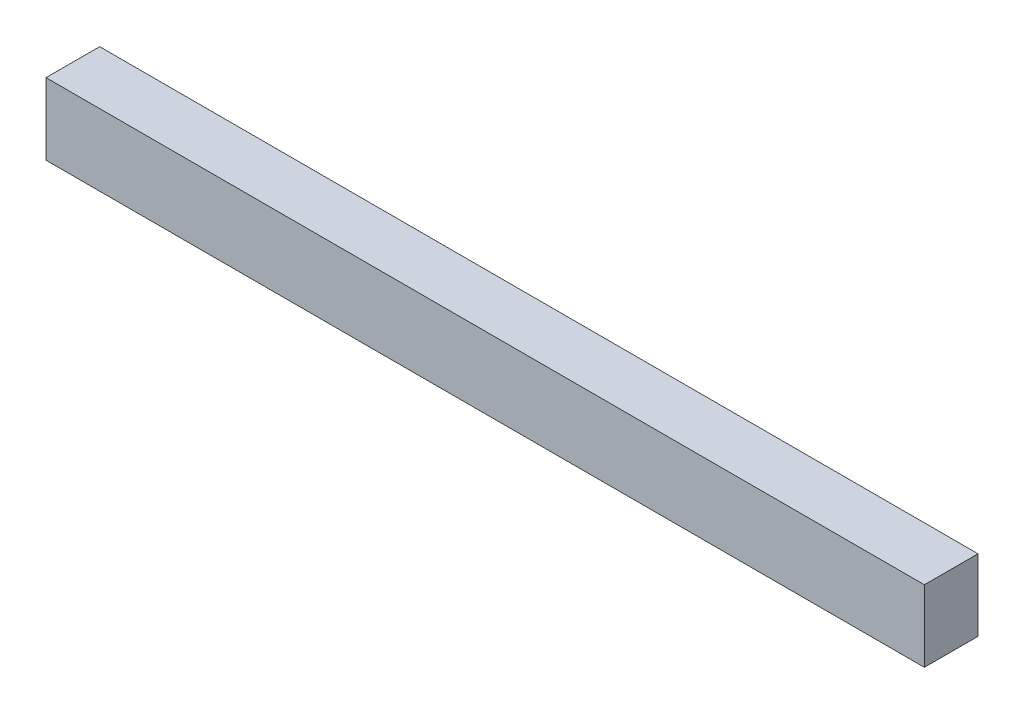
ISO-10303-21;
HEADER;
FILE_DESCRIPTION(('STEP AP214'),'2;1');
FILE_NAME('part.step','',(''),(''),'','','');
FILE_SCHEMA(('AUTOMOTIVE_DESIGN { 1 0 10303 214 1 1 1 1 }'));
ENDSEC;
DATA;
#1=APPLICATION_CONTEXT('core data for automotive mechanical design processes');
#2=APPLICATION_PROTOCOL_DEFINITION('international standard','automotive_design',2000,#1);
#3=PRODUCT_CONTEXT('',#1,'mechanical');
#4=PRODUCT('Part','Part','',(#3));
#5=PRODUCT_RELATED_PRODUCT_CATEGORY('part','',(#4));
#6=PRODUCT_DEFINITION_FORMATION('','',#4);
#7=PRODUCT_DEFINITION_CONTEXT('part definition',#1,'design');
#8=PRODUCT_DEFINITION('design','',#6,#7);
#9=PRODUCT_DEFINITION_SHAPE('','',#8);
#10=(LENGTH_UNIT() NAMED_UNIT(*) SI_UNIT(.MILLI.,.METRE.));
#11=(NAMED_UNIT(*) PLANE_ANGLE_UNIT() SI_UNIT($,.RADIAN.));
#12=(NAMED_UNIT(*) SI_UNIT($,.STERADIAN.) SOLID_ANGLE_UNIT());
#13=UNCERTAINTY_MEASURE_WITH_UNIT(LENGTH_MEASURE(1.E-05),#10,'distance_accuracy_value','');
#14=(GEOMETRIC_REPRESENTATION_CONTEXT(3) GLOBAL_UNCERTAINTY_ASSIGNED_CONTEXT((#13)) GLOBAL_UNIT_ASSIGNED_CONTEXT((#10,
#11,#12)) REPRESENTATION_CONTEXT('',''));
#15=CARTESIAN_POINT('',(0.,0.,0.));
#16=DIRECTION('',(0.,0.,1.));
#17=DIRECTION('',(1.,0.,0.));
#18=AXIS2_PLACEMENT_3D('',#15,#16,#17);
#19=CARTESIAN_POINT('',(-77.978,6.34999999999999,4.7625));
#20=DIRECTION('',(1.,0.,0.));
#21=DIRECTION('',(0.,0.,-1.));
#22=AXIS2_PLACEMENT_3D('',#19,#20,#21);
#23=PLANE('',#22);
#24=DIRECTION('',(0.,-1.,0.));
#25=VECTOR('',#24,1.);
#26=CARTESIAN_POINT('',(-77.978,6.34999999999999,-4.7625));
#27=LINE('',#26,#25);
#28=CARTESIAN_POINT('',(-77.978,6.34999999999999,-4.7625));
#29=VERTEX_POINT('',#28);
#30=CARTESIAN_POINT('',(-77.978,-6.35,-4.7625));
#31=VERTEX_POINT('',#30);
#32=EDGE_CURVE('E416',#29,#31,#27,.T.);
#33=ORIENTED_EDGE('',*,*,#32,.T.);
#34=DIRECTION('',(0.,0.,-1.));
#35=VECTOR('',#34,1.);
#36=CARTESIAN_POINT('',(-77.978,-6.35,4.7625));
#37=LINE('',#36,#35);
#38=CARTESIAN_POINT('',(-77.978,-6.35,4.7625));
#39=VERTEX_POINT('',#38);
#40=EDGE_CURVE('E11',#39,#31,#37,.T.);
#41=ORIENTED_EDGE('',*,*,#40,.F.);
#42=DIRECTION('',(0.,-1.,0.));
#43=VECTOR('',#42,1.);
#44=CARTESIAN_POINT('',(-77.978,6.34999999999999,4.7625));
#45=LINE('',#44,#43);
#46=CARTESIAN_POINT('',(-77.978,6.34999999999999,4.7625));
#47=VERTEX_POINT('',#46);
#48=EDGE_CURVE('E434',#47,#39,#45,.T.);
#49=ORIENTED_EDGE('',*,*,#48,.F.);
#50=DIRECTION('',(0.,0.,-1.));
#51=VECTOR('',#50,1.);
#52=CARTESIAN_POINT('',(-77.978,6.34999999999999,4.7625));
#53=LINE('',#52,#51);
#54=EDGE_CURVE('E428',#47,#29,#53,.T.);
#55=ORIENTED_EDGE('',*,*,#54,.T.);
#56=EDGE_LOOP('',(#33,#41,#49,#55));
#57=FACE_BOUND('',#56,.T.);
#58=ADVANCED_FACE('F372',(#57),#23,.F.);
#59=CARTESIAN_POINT('',(-77.978,-6.35,4.7625));
#60=DIRECTION('',(0.,1.,0.));
#61=DIRECTION('',(0.,0.,1.));
#62=AXIS2_PLACEMENT_3D('',#59,#60,#61);
#63=PLANE('',#62);
#64=DIRECTION('',(1.,0.,0.));
#65=VECTOR('',#64,1.);
#66=CARTESIAN_POINT('',(-77.978,-6.35,-4.7625));
#67=LINE('',#66,#65);
#68=CARTESIAN_POINT('',(77.978,-6.35,-4.7625));
#69=VERTEX_POINT('',#68);
#70=EDGE_CURVE('E412',#31,#69,#67,.T.);
#71=ORIENTED_EDGE('',*,*,#70,.T.);
#72=DIRECTION('',(0.,0.,-1.));
#73=VECTOR('',#72,1.);
#74=CARTESIAN_POINT('',(77.978,-6.35,4.7625));
#75=LINE('',#74,#73);
#76=CARTESIAN_POINT('',(77.978,-6.35,4.7625));
#77=VERTEX_POINT('',#76);
#78=EDGE_CURVE('E379',#77,#69,#75,.T.);
#79=ORIENTED_EDGE('',*,*,#78,.F.);
#80=DIRECTION('',(1.,0.,0.));
#81=VECTOR('',#80,1.);
#82=CARTESIAN_POINT('',(-77.978,-6.35,4.7625));
#83=LINE('',#82,#81);
#84=EDGE_CURVE('E424',#39,#77,#83,.T.);
#85=ORIENTED_EDGE('',*,*,#84,.F.);
#86=ORIENTED_EDGE('',*,*,#40,.T.);
#87=EDGE_LOOP('',(#71,#79,#85,#86));
#88=FACE_BOUND('',#87,.T.);
#89=ADVANCED_FACE('F423',(#88),#63,.F.);
#90=CARTESIAN_POINT('',(77.978,6.34999999999999,4.7625));
#91=DIRECTION('',(-1.,0.,0.));
#92=DIRECTION('',(0.,0.,1.));
#93=AXIS2_PLACEMENT_3D('',#90,#91,#92);
#94=PLANE('',#93);
#95=DIRECTION('',(0.,1.,0.));
#96=VECTOR('',#95,1.);
#97=CARTESIAN_POINT('',(77.978,6.34999999999999,-4.7625));
#98=LINE('',#97,#96);
#99=CARTESIAN_POINT('',(77.978,6.34999999999999,-4.7625));
#100=VERTEX_POINT('',#99);
#101=EDGE_CURVE('E417',#69,#100,#98,.T.);
#102=ORIENTED_EDGE('',*,*,#101,.T.);
#103=DIRECTION('',(0.,0.,-1.));
#104=VECTOR('',#103,1.);
#105=CARTESIAN_POINT('',(77.978,6.34999999999999,4.7625));
#106=LINE('',#105,#104);
#107=CARTESIAN_POINT('',(77.978,6.34999999999999,4.7625));
#108=VERTEX_POINT('',#107);
#109=EDGE_CURVE('E440',#108,#100,#106,.T.);
#110=ORIENTED_EDGE('',*,*,#109,.F.);
#111=DIRECTION('',(0.,1.,0.));
#112=VECTOR('',#111,1.);
#113=CARTESIAN_POINT('',(77.978,6.34999999999999,4.7625));
#114=LINE('',#113,#112);
#115=EDGE_CURVE('E391',#77,#108,#114,.T.);
#116=ORIENTED_EDGE('',*,*,#115,.F.);
#117=ORIENTED_EDGE('',*,*,#78,.T.);
#118=EDGE_LOOP('',(#102,#110,#116,#117));
#119=FACE_BOUND('',#118,.T.);
#120=ADVANCED_FACE('F443',(#119),#94,.F.);
#121=CARTESIAN_POINT('',(-77.978,6.34999999999999,4.7625));
#122=DIRECTION('',(0.,-1.,0.));
#123=DIRECTION('',(0.,0.,-1.));
#124=AXIS2_PLACEMENT_3D('',#121,#122,#123);
#125=PLANE('',#124);
#126=DIRECTION('',(-1.,0.,0.));
#127=VECTOR('',#126,1.);
#128=CARTESIAN_POINT('',(-77.978,6.34999999999999,-4.7625));
#129=LINE('',#128,#127);
#130=EDGE_CURVE('E432',#100,#29,#129,.T.);
#131=ORIENTED_EDGE('',*,*,#130,.T.);
#132=ORIENTED_EDGE('',*,*,#54,.F.);
#133=DIRECTION('',(-1.,0.,0.));
#134=VECTOR('',#133,1.);
#135=CARTESIAN_POINT('',(-77.978,6.34999999999999,4.7625));
#136=LINE('',#135,#134);
#137=EDGE_CURVE('E386',#108,#47,#136,.T.);
#138=ORIENTED_EDGE('',*,*,#137,.F.);
#139=ORIENTED_EDGE('',*,*,#109,.T.);
#140=EDGE_LOOP('',(#131,#132,#138,#139));
#141=FACE_BOUND('',#140,.T.);
#142=ADVANCED_FACE('F445',(#141),#125,.F.);
#143=CARTESIAN_POINT('',(-77.978,-6.35,4.7625));
#144=DIRECTION('',(0.,0.,1.));
#145=DIRECTION('',(1.,0.,0.));
#146=AXIS2_PLACEMENT_3D('',#143,#144,#145);
#147=PLANE('',#146);
#148=ORIENTED_EDGE('',*,*,#48,.T.);
#149=ORIENTED_EDGE('',*,*,#84,.T.);
#150=ORIENTED_EDGE('',*,*,#115,.T.);
#151=ORIENTED_EDGE('',*,*,#137,.T.);
#152=EDGE_LOOP('',(#148,#149,#150,#151));
#153=FACE_BOUND('',#152,.T.);
#154=ADVANCED_FACE('F446',(#153),#147,.T.);
#155=CARTESIAN_POINT('',(-77.978,-6.35,-4.7625));
#156=DIRECTION('',(0.,0.,1.));
#157=DIRECTION('',(1.,0.,0.));
#158=AXIS2_PLACEMENT_3D('',#155,#156,#157);
#159=PLANE('',#158);
#160=ORIENTED_EDGE('',*,*,#32,.F.);
#161=ORIENTED_EDGE('',*,*,#130,.F.);
#162=ORIENTED_EDGE('',*,*,#101,.F.);
#163=ORIENTED_EDGE('',*,*,#70,.F.);
#164=EDGE_LOOP('',(#160,#161,#162,#163));
#165=FACE_BOUND('',#164,.T.);
#166=ADVANCED_FACE('F413',(#165),#159,.F.);
#167=CLOSED_SHELL('',(#58,#89,#120,#142,#154,#166));
#168=MANIFOLD_SOLID_BREP('B2',#167);
#169=ADVANCED_BREP_SHAPE_REPRESENTATION('',(#18,#168),#14);
#170=SHAPE_DEFINITION_REPRESENTATION(#9,#169);
ENDSEC;
END-ISO-10303-21;
